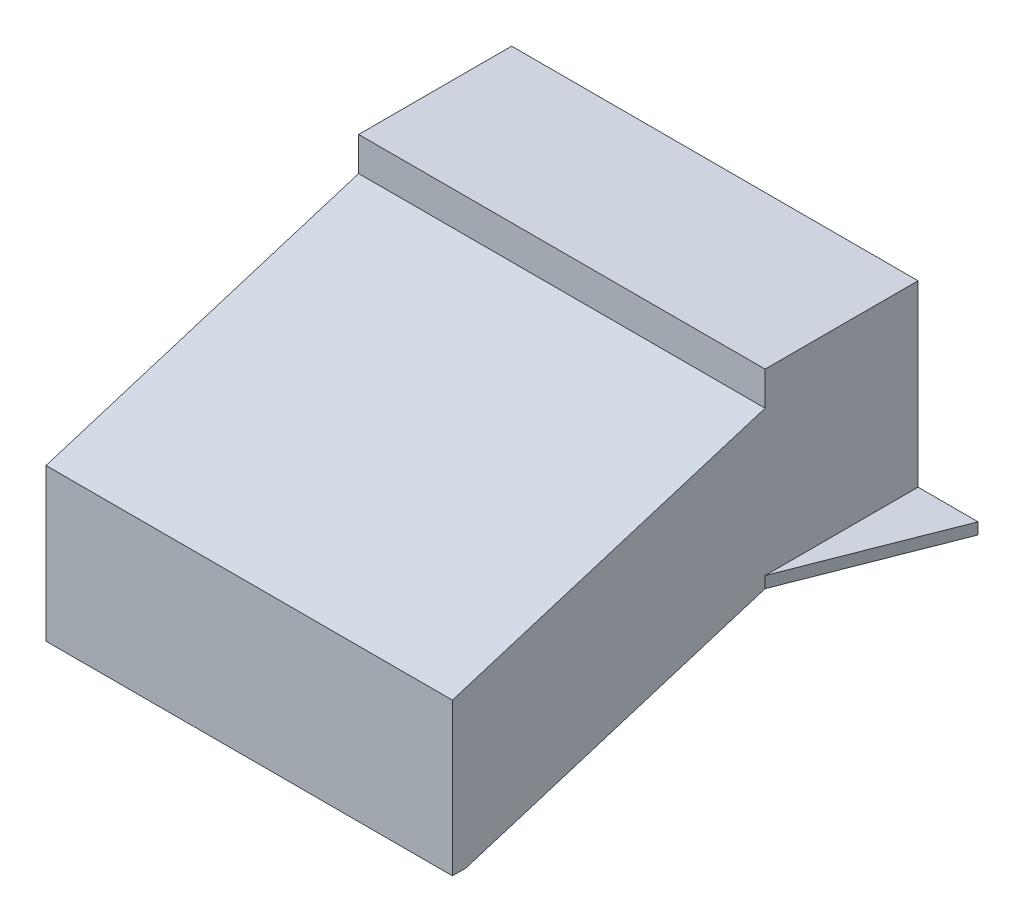
ISO-10303-21;
HEADER;
FILE_DESCRIPTION(('STEP AP214'),'2;1');
FILE_NAME('part.step','',(''),(''),'','','');
FILE_SCHEMA(('AUTOMOTIVE_DESIGN { 1 0 10303 214 1 1 1 1 }'));
ENDSEC;
DATA;
#1=APPLICATION_CONTEXT('core data for automotive mechanical design processes');
#2=APPLICATION_PROTOCOL_DEFINITION('international standard','automotive_design',2000,#1);
#3=PRODUCT_CONTEXT('',#1,'mechanical');
#4=PRODUCT('Part','Part','',(#3));
#5=PRODUCT_RELATED_PRODUCT_CATEGORY('part','',(#4));
#6=PRODUCT_DEFINITION_FORMATION('','',#4);
#7=PRODUCT_DEFINITION_CONTEXT('part definition',#1,'design');
#8=PRODUCT_DEFINITION('design','',#6,#7);
#9=PRODUCT_DEFINITION_SHAPE('','',#8);
#10=(LENGTH_UNIT() NAMED_UNIT(*) SI_UNIT(.MILLI.,.METRE.));
#11=(NAMED_UNIT(*) PLANE_ANGLE_UNIT() SI_UNIT($,.RADIAN.));
#12=(NAMED_UNIT(*) SI_UNIT($,.STERADIAN.) SOLID_ANGLE_UNIT());
#13=UNCERTAINTY_MEASURE_WITH_UNIT(LENGTH_MEASURE(1.E-05),#10,'distance_accuracy_value','');
#14=(GEOMETRIC_REPRESENTATION_CONTEXT(3) GLOBAL_UNCERTAINTY_ASSIGNED_CONTEXT((#13)) GLOBAL_UNIT_ASSIGNED_CONTEXT((#10,
#11,#12)) REPRESENTATION_CONTEXT('',''));
#15=CARTESIAN_POINT('',(0.,0.,0.));
#16=DIRECTION('',(0.,0.,1.));
#17=DIRECTION('',(1.,0.,0.));
#18=AXIS2_PLACEMENT_3D('',#15,#16,#17);
#19=CARTESIAN_POINT('',(91.,55.68,0.));
#20=DIRECTION('',(-1.,0.,0.));
#21=DIRECTION('',(0.,0.,1.));
#22=AXIS2_PLACEMENT_3D('',#19,#20,#21);
#23=PLANE('',#22);
#24=DIRECTION('',(0.,-0.294927547939755,0.955519618566905));
#25=VECTOR('',#24,1.);
#26=CARTESIAN_POINT('',(91.,36.7987931064781,-5.82781132176169));
#27=LINE('',#26,#25);
#28=CARTESIAN_POINT('',(91.,55.68,-67.));
#29=VERTEX_POINT('',#28);
#30=CARTESIAN_POINT('',(91.,34.0740298507613,2.99999999997874));
#31=VERTEX_POINT('',#30);
#32=EDGE_CURVE('E310',#29,#31,#27,.T.);
#33=ORIENTED_EDGE('',*,*,#32,.T.);
#34=DIRECTION('',(0.,1.,0.));
#35=VECTOR('',#34,1.);
#36=CARTESIAN_POINT('',(91.,35.,3.));
#37=LINE('',#36,#35);
#38=CARTESIAN_POINT('',(91.,0.,3.));
#39=VERTEX_POINT('',#38);
#40=EDGE_CURVE('E220',#39,#31,#37,.T.);
#41=ORIENTED_EDGE('',*,*,#40,.F.);
#42=DIRECTION('',(0.,0.,-1.));
#43=VECTOR('',#42,1.);
#44=CARTESIAN_POINT('',(91.,0.,3.));
#45=LINE('',#44,#43);
#46=CARTESIAN_POINT('',(91.,0.,0.));
#47=VERTEX_POINT('',#46);
#48=EDGE_CURVE('E223',#39,#47,#45,.T.);
#49=ORIENTED_EDGE('',*,*,#48,.T.);
#50=DIRECTION('',(0.,0.294927547939755,-0.955519618566905));
#51=VECTOR('',#50,1.);
#52=CARTESIAN_POINT('',(91.,4.84317215515956,-15.691128355691));
#53=LINE('',#52,#51);
#54=CARTESIAN_POINT('',(91.,20.68,-67.));
#55=VERTEX_POINT('',#54);
#56=EDGE_CURVE('E319',#47,#55,#53,.T.);
#57=ORIENTED_EDGE('',*,*,#56,.T.);
#58=DIRECTION('',(0.,-1.,0.));
#59=VECTOR('',#58,1.);
#60=CARTESIAN_POINT('',(91.,20.68,-67.));
#61=LINE('',#60,#59);
#62=CARTESIAN_POINT('',(91.,23.2389421098418,-67.));
#63=VERTEX_POINT('',#62);
#64=EDGE_CURVE('E241',#63,#55,#61,.T.);
#65=ORIENTED_EDGE('',*,*,#64,.F.);
#66=DIRECTION('',(0.,0.,1.));
#67=VECTOR('',#66,1.);
#68=CARTESIAN_POINT('',(91.,23.2389421098418,-67.));
#69=LINE('',#68,#67);
#70=CARTESIAN_POINT('',(91.,23.2389421098418,-101.25));
#71=VERTEX_POINT('',#70);
#72=EDGE_CURVE('E245',#71,#63,#69,.T.);
#73=ORIENTED_EDGE('',*,*,#72,.F.);
#74=DIRECTION('',(0.,-1.,0.));
#75=VECTOR('',#74,1.);
#76=CARTESIAN_POINT('',(91.,55.68,-101.25));
#77=LINE('',#76,#75);
#78=CARTESIAN_POINT('',(91.,63.26,-101.25));
#79=VERTEX_POINT('',#78);
#80=EDGE_CURVE('E275',#79,#71,#77,.T.);
#81=ORIENTED_EDGE('',*,*,#80,.F.);
#82=DIRECTION('',(0.,0.,-1.));
#83=VECTOR('',#82,1.);
#84=CARTESIAN_POINT('',(91.,63.26,-101.25));
#85=LINE('',#84,#83);
#86=CARTESIAN_POINT('',(91.,63.26,-67.));
#87=VERTEX_POINT('',#86);
#88=EDGE_CURVE('E198',#87,#79,#85,.T.);
#89=ORIENTED_EDGE('',*,*,#88,.F.);
#90=DIRECTION('',(0.,-1.,0.));
#91=VECTOR('',#90,1.);
#92=CARTESIAN_POINT('',(91.,63.26,-67.));
#93=LINE('',#92,#91);
#94=EDGE_CURVE('E209',#87,#29,#93,.T.);
#95=ORIENTED_EDGE('',*,*,#94,.T.);
#96=EDGE_LOOP('',(#33,#41,#49,#57,#65,#73,#81,#89,#95));
#97=FACE_BOUND('',#96,.T.);
#98=ADVANCED_FACE('F34',(#97),#23,.F.);
#99=CARTESIAN_POINT('',(0.,55.68,0.));
#100=DIRECTION('',(1.,0.,0.));
#101=DIRECTION('',(0.,0.,-1.));
#102=AXIS2_PLACEMENT_3D('',#99,#100,#101);
#103=PLANE('',#102);
#104=DIRECTION('',(0.,-1.,0.));
#105=VECTOR('',#104,1.);
#106=CARTESIAN_POINT('',(0.,35.,3.));
#107=LINE('',#106,#105);
#108=CARTESIAN_POINT('',(0.,34.0740298507613,3.));
#109=VERTEX_POINT('',#108);
#110=CARTESIAN_POINT('',(0.,0.,3.));
#111=VERTEX_POINT('',#110);
#112=EDGE_CURVE('E216',#109,#111,#107,.T.);
#113=ORIENTED_EDGE('',*,*,#112,.F.);
#114=DIRECTION('',(0.,-0.294927547939755,0.955519618566905));
#115=VECTOR('',#114,1.);
#116=CARTESIAN_POINT('',(0.,35.,0.));
#117=LINE('',#116,#115);
#118=CARTESIAN_POINT('',(0.,55.68,-67.));
#119=VERTEX_POINT('',#118);
#120=EDGE_CURVE('E56',#119,#109,#117,.T.);
#121=ORIENTED_EDGE('',*,*,#120,.F.);
#122=DIRECTION('',(0.,-1.,0.));
#123=VECTOR('',#122,1.);
#124=CARTESIAN_POINT('',(0.,63.26,-67.));
#125=LINE('',#124,#123);
#126=CARTESIAN_POINT('',(0.,63.26,-67.));
#127=VERTEX_POINT('',#126);
#128=EDGE_CURVE('E212',#127,#119,#125,.T.);
#129=ORIENTED_EDGE('',*,*,#128,.F.);
#130=DIRECTION('',(0.,0.,1.));
#131=VECTOR('',#130,1.);
#132=CARTESIAN_POINT('',(0.,63.26,-101.25));
#133=LINE('',#132,#131);
#134=CARTESIAN_POINT('',(0.,63.26,-101.25));
#135=VERTEX_POINT('',#134);
#136=EDGE_CURVE('E205',#135,#127,#133,.T.);
#137=ORIENTED_EDGE('',*,*,#136,.F.);
#138=DIRECTION('',(0.,1.,0.));
#139=VECTOR('',#138,1.);
#140=CARTESIAN_POINT('',(0.,55.68,-101.25));
#141=LINE('',#140,#139);
#142=CARTESIAN_POINT('',(0.,23.2300552231024,-101.25));
#143=VERTEX_POINT('',#142);
#144=EDGE_CURVE('E284',#143,#135,#141,.T.);
#145=ORIENTED_EDGE('',*,*,#144,.F.);
#146=DIRECTION('',(0.,0.,-1.));
#147=VECTOR('',#146,1.);
#148=CARTESIAN_POINT('',(0.,23.2300552231024,-67.));
#149=LINE('',#148,#147);
#150=CARTESIAN_POINT('',(0.,23.2300552231024,-67.));
#151=VERTEX_POINT('',#150);
#152=EDGE_CURVE('E255',#151,#143,#149,.T.);
#153=ORIENTED_EDGE('',*,*,#152,.F.);
#154=DIRECTION('',(0.,1.,0.));
#155=VECTOR('',#154,1.);
#156=CARTESIAN_POINT('',(0.,20.68,-67.));
#157=LINE('',#156,#155);
#158=CARTESIAN_POINT('',(0.,20.68,-67.));
#159=VERTEX_POINT('',#158);
#160=EDGE_CURVE('E251',#159,#151,#157,.T.);
#161=ORIENTED_EDGE('',*,*,#160,.F.);
#162=DIRECTION('',(0.,0.294927547939755,-0.955519618566905));
#163=VECTOR('',#162,1.);
#164=CARTESIAN_POINT('',(0.,20.68,-67.));
#165=LINE('',#164,#163);
#166=CARTESIAN_POINT('',(0.,0.,0.));
#167=VERTEX_POINT('',#166);
#168=EDGE_CURVE('E312',#167,#159,#165,.T.);
#169=ORIENTED_EDGE('',*,*,#168,.F.);
#170=DIRECTION('',(0.,0.,-1.));
#171=VECTOR('',#170,1.);
#172=CARTESIAN_POINT('',(0.,0.,3.));
#173=LINE('',#172,#171);
#174=EDGE_CURVE('E228',#111,#167,#173,.T.);
#175=ORIENTED_EDGE('',*,*,#174,.F.);
#176=EDGE_LOOP('',(#113,#121,#129,#137,#145,#153,#161,#169,#175));
#177=FACE_BOUND('',#176,.T.);
#178=ADVANCED_FACE('F36',(#177),#103,.F.);
#179=CARTESIAN_POINT('',(91.,20.68,-101.25));
#180=DIRECTION('',(0.,1.,0.));
#181=DIRECTION('',(0.,0.,1.));
#182=AXIS2_PLACEMENT_3D('',#179,#180,#181);
#183=PLANE('',#182);
#184=DIRECTION('',(-1.,0.,0.));
#185=VECTOR('',#184,1.);
#186=CARTESIAN_POINT('',(91.,20.68,-101.25));
#187=LINE('',#186,#185);
#188=CARTESIAN_POINT('',(104.42,20.68,-101.25));
#189=VERTEX_POINT('',#188);
#190=CARTESIAN_POINT('',(89.,20.68,-101.25));
#191=VERTEX_POINT('',#190);
#192=EDGE_CURVE('E281',#189,#191,#187,.T.);
#193=ORIENTED_EDGE('',*,*,#192,.F.);
#194=DIRECTION('',(-0.364819561220122,0.,0.931078239328553));
#195=VECTOR('',#194,1.);
#196=CARTESIAN_POINT('',(102.633887749621,20.68,-96.6915540554772));
#197=LINE('',#196,#195);
#198=EDGE_CURVE('E233',#189,#55,#197,.T.);
#199=ORIENTED_EDGE('',*,*,#198,.T.);
#200=DIRECTION('',(-1.,0.,0.));
#201=VECTOR('',#200,1.);
#202=CARTESIAN_POINT('',(99.,20.68,-67.));
#203=LINE('',#202,#201);
#204=CARTESIAN_POINT('',(89.,20.68,-67.));
#205=VERTEX_POINT('',#204);
#206=EDGE_CURVE('E316',#55,#205,#203,.T.);
#207=ORIENTED_EDGE('',*,*,#206,.T.);
#208=DIRECTION('',(0.,0.,1.));
#209=VECTOR('',#208,1.);
#210=CARTESIAN_POINT('',(89.,20.68,-67.));
#211=LINE('',#210,#209);
#212=EDGE_CURVE('E261',#191,#205,#211,.T.);
#213=ORIENTED_EDGE('',*,*,#212,.F.);
#214=EDGE_LOOP('',(#193,#199,#207,#213));
#215=FACE_BOUND('',#214,.T.);
#216=ADVANCED_FACE('F376',(#215),#183,.F.);
#217=CARTESIAN_POINT('',(99.,20.68,-67.));
#218=DIRECTION('',(0.,0.955519618566905,0.294927547939755));
#219=DIRECTION('',(0.,-0.294927547939755,0.955519618566905));
#220=AXIS2_PLACEMENT_3D('',#217,#218,#219);
#221=PLANE('',#220);
#222=CARTESIAN_POINT('',(2.,20.68,-67.));
#223=VERTEX_POINT('',#222);
#224=EDGE_CURVE('E315',#223,#159,#203,.T.);
#225=ORIENTED_EDGE('',*,*,#224,.F.);
#226=DIRECTION('',(0.,0.294927547939755,-0.955519618566905));
#227=VECTOR('',#226,1.);
#228=CARTESIAN_POINT('',(2.,0.,0.));
#229=LINE('',#228,#227);
#230=CARTESIAN_POINT('',(2.,0.,0.));
#231=VERTEX_POINT('',#230);
#232=EDGE_CURVE('E286',#231,#223,#229,.T.);
#233=ORIENTED_EDGE('',*,*,#232,.F.);
#234=DIRECTION('',(1.,0.,0.));
#235=VECTOR('',#234,1.);
#236=CARTESIAN_POINT('',(0.,0.,0.));
#237=LINE('',#236,#235);
#238=EDGE_CURVE('E326',#167,#231,#237,.T.);
#239=ORIENTED_EDGE('',*,*,#238,.F.);
#240=ORIENTED_EDGE('',*,*,#168,.T.);
#241=EDGE_LOOP('',(#225,#233,#239,#240));
#242=FACE_BOUND('',#241,.T.);
#243=ADVANCED_FACE('F352',(#242),#221,.F.);
#244=CARTESIAN_POINT('',(89.,0.,0.));
#245=VERTEX_POINT('',#244);
#246=EDGE_CURVE('E322',#245,#47,#237,.T.);
#247=ORIENTED_EDGE('',*,*,#246,.F.);
#248=DIRECTION('',(0.,0.294927547939755,-0.955519618566905));
#249=VECTOR('',#248,1.);
#250=CARTESIAN_POINT('',(89.,20.68,-67.));
#251=LINE('',#250,#249);
#252=EDGE_CURVE('E325',#245,#205,#251,.T.);
#253=ORIENTED_EDGE('',*,*,#252,.T.);
#254=ORIENTED_EDGE('',*,*,#206,.F.);
#255=ORIENTED_EDGE('',*,*,#56,.F.);
#256=EDGE_LOOP('',(#247,#253,#254,#255));
#257=FACE_BOUND('',#256,.T.);
#258=ADVANCED_FACE('F379',(#257),#221,.F.);
#259=CARTESIAN_POINT('',(99.,35.,0.));
#260=DIRECTION('',(0.,-0.955519618566905,-0.294927547939755));
#261=DIRECTION('',(0.,0.294927547939755,-0.955519618566905));
#262=AXIS2_PLACEMENT_3D('',#259,#260,#261);
#263=PLANE('',#262);
#264=DIRECTION('',(-1.,0.,0.));
#265=VECTOR('',#264,1.);
#266=CARTESIAN_POINT('',(0.,55.68,-67.));
#267=LINE('',#266,#265);
#268=EDGE_CURVE('E323',#29,#119,#267,.T.);
#269=ORIENTED_EDGE('',*,*,#268,.T.);
#270=ORIENTED_EDGE('',*,*,#120,.T.);
#271=DIRECTION('',(1.,0.,0.));
#272=VECTOR('',#271,1.);
#273=CARTESIAN_POINT('',(0.,34.0740298507548,3.));
#274=LINE('',#273,#272);
#275=EDGE_CURVE('E11',#109,#31,#274,.T.);
#276=ORIENTED_EDGE('',*,*,#275,.T.);
#277=ORIENTED_EDGE('',*,*,#32,.F.);
#278=EDGE_LOOP('',(#269,#270,#276,#277));
#279=FACE_BOUND('',#278,.T.);
#280=ADVANCED_FACE('F390',(#279),#263,.F.);
#281=CARTESIAN_POINT('',(0.,29.6211081755741,9.14275398613241));
#282=DIRECTION('',(0.,0.955519618566905,0.294927547939755));
#283=DIRECTION('',(0.,-0.294927547939755,0.955519618566905));
#284=AXIS2_PLACEMENT_3D('',#281,#282,#283);
#285=PLANE('',#284);
#286=DIRECTION('',(0.,0.294927547939755,-0.955519618566905));
#287=VECTOR('',#286,1.);
#288=CARTESIAN_POINT('',(2.,29.6211081755741,9.14275398613241));
#289=LINE('',#288,#287);
#290=CARTESIAN_POINT('',(2.,32.4430805999504,0.));
#291=VERTEX_POINT('',#290);
#292=CARTESIAN_POINT('',(2.,53.1230805999504,-67.));
#293=VERTEX_POINT('',#292);
#294=EDGE_CURVE('E287',#291,#293,#289,.T.);
#295=ORIENTED_EDGE('',*,*,#294,.T.);
#296=DIRECTION('',(-1.,0.,0.));
#297=VECTOR('',#296,1.);
#298=CARTESIAN_POINT('',(0.,53.1230805999504,-67.));
#299=LINE('',#298,#297);
#300=CARTESIAN_POINT('',(89.,53.1230805999504,-67.));
#301=VERTEX_POINT('',#300);
#302=EDGE_CURVE('E42',#301,#293,#299,.T.);
#303=ORIENTED_EDGE('',*,*,#302,.F.);
#304=DIRECTION('',(0.,-0.294927547939755,0.955519618566905));
#305=VECTOR('',#304,1.);
#306=CARTESIAN_POINT('',(89.,29.6211081755741,9.14275398613241));
#307=LINE('',#306,#305);
#308=CARTESIAN_POINT('',(89.,32.4430805999504,0.));
#309=VERTEX_POINT('',#308);
#310=EDGE_CURVE('E290',#301,#309,#307,.T.);
#311=ORIENTED_EDGE('',*,*,#310,.T.);
#312=DIRECTION('',(1.,0.,0.));
#313=VECTOR('',#312,1.);
#314=CARTESIAN_POINT('',(0.,32.4430805999504,0.));
#315=LINE('',#314,#313);
#316=EDGE_CURVE('E306',#291,#309,#315,.T.);
#317=ORIENTED_EDGE('',*,*,#316,.F.);
#318=EDGE_LOOP('',(#295,#303,#311,#317));
#319=FACE_BOUND('',#318,.T.);
#320=ADVANCED_FACE('F336',(#319),#285,.F.);
#321=CARTESIAN_POINT('',(2.,29.6211081755741,9.14275398613241));
#322=DIRECTION('',(-1.,0.,0.));
#323=DIRECTION('',(0.,0.,1.));
#324=AXIS2_PLACEMENT_3D('',#321,#322,#323);
#325=PLANE('',#324);
#326=ORIENTED_EDGE('',*,*,#232,.T.);
#327=DIRECTION('',(0.,0.,-1.));
#328=VECTOR('',#327,1.);
#329=CARTESIAN_POINT('',(2.,20.68,-67.));
#330=LINE('',#329,#328);
#331=CARTESIAN_POINT('',(2.,20.68,-101.25));
#332=VERTEX_POINT('',#331);
#333=EDGE_CURVE('E264',#223,#332,#330,.T.);
#334=ORIENTED_EDGE('',*,*,#333,.T.);
#335=DIRECTION('',(0.,-1.,0.));
#336=VECTOR('',#335,1.);
#337=CARTESIAN_POINT('',(2.,53.12,-101.25));
#338=LINE('',#337,#336);
#339=CARTESIAN_POINT('',(2.,60.25,-101.25));
#340=VERTEX_POINT('',#339);
#341=EDGE_CURVE('E270',#340,#332,#338,.T.);
#342=ORIENTED_EDGE('',*,*,#341,.F.);
#343=DIRECTION('',(0.,0.,-1.));
#344=VECTOR('',#343,1.);
#345=CARTESIAN_POINT('',(2.,60.25,-101.25));
#346=LINE('',#345,#344);
#347=CARTESIAN_POINT('',(2.,60.25,-69.3196896173482));
#348=VERTEX_POINT('',#347);
#349=EDGE_CURVE('E188',#348,#340,#346,.T.);
#350=ORIENTED_EDGE('',*,*,#349,.F.);
#351=DIRECTION('',(0.,-1.,0.));
#352=VECTOR('',#351,1.);
#353=CARTESIAN_POINT('',(2.,60.25,-69.3196896173482));
#354=LINE('',#353,#352);
#355=CARTESIAN_POINT('',(2.,53.12,-69.3196896173482));
#356=VERTEX_POINT('',#355);
#357=EDGE_CURVE('E179',#348,#356,#354,.T.);
#358=ORIENTED_EDGE('',*,*,#357,.T.);
#359=DIRECTION('',(0.,0.,-1.));
#360=VECTOR('',#359,1.);
#361=CARTESIAN_POINT('',(2.,53.12,-67.));
#362=LINE('',#361,#360);
#363=CARTESIAN_POINT('',(2.,53.12,-67.));
#364=VERTEX_POINT('',#363);
#365=EDGE_CURVE('E267',#364,#356,#362,.T.);
#366=ORIENTED_EDGE('',*,*,#365,.F.);
#367=DIRECTION('',(0.,-1.,0.));
#368=VECTOR('',#367,1.);
#369=CARTESIAN_POINT('',(2.,55.68,-67.));
#370=LINE('',#369,#368);
#371=EDGE_CURVE('E300',#293,#364,#370,.T.);
#372=ORIENTED_EDGE('',*,*,#371,.F.);
#373=ORIENTED_EDGE('',*,*,#294,.F.);
#374=DIRECTION('',(0.,1.,0.));
#375=VECTOR('',#374,1.);
#376=CARTESIAN_POINT('',(2.,55.68,0.));
#377=LINE('',#376,#375);
#378=EDGE_CURVE('E303',#231,#291,#377,.T.);
#379=ORIENTED_EDGE('',*,*,#378,.F.);
#380=EDGE_LOOP('',(#326,#334,#342,#350,#358,#366,#372,#373,#379));
#381=FACE_BOUND('',#380,.T.);
#382=ADVANCED_FACE('F339',(#381),#325,.F.);
#383=CARTESIAN_POINT('',(89.,29.6211081755741,9.14275398613241));
#384=DIRECTION('',(1.,0.,0.));
#385=DIRECTION('',(0.,0.,-1.));
#386=AXIS2_PLACEMENT_3D('',#383,#384,#385);
#387=PLANE('',#386);
#388=ORIENTED_EDGE('',*,*,#310,.F.);
#389=DIRECTION('',(0.,1.,0.));
#390=VECTOR('',#389,1.);
#391=CARTESIAN_POINT('',(89.,55.68,-67.));
#392=LINE('',#391,#390);
#393=CARTESIAN_POINT('',(89.,53.12,-67.));
#394=VERTEX_POINT('',#393);
#395=EDGE_CURVE('E293',#394,#301,#392,.T.);
#396=ORIENTED_EDGE('',*,*,#395,.F.);
#397=DIRECTION('',(0.,0.,1.));
#398=VECTOR('',#397,1.);
#399=CARTESIAN_POINT('',(89.,53.12,-67.));
#400=LINE('',#399,#398);
#401=CARTESIAN_POINT('',(89.,53.12,-69.3196896173482));
#402=VERTEX_POINT('',#401);
#403=EDGE_CURVE('E178',#402,#394,#400,.T.);
#404=ORIENTED_EDGE('',*,*,#403,.F.);
#405=DIRECTION('',(0.,-1.,0.));
#406=VECTOR('',#405,1.);
#407=CARTESIAN_POINT('',(89.,60.25,-69.3196896173482));
#408=LINE('',#407,#406);
#409=CARTESIAN_POINT('',(89.,60.25,-69.3196896173482));
#410=VERTEX_POINT('',#409);
#411=EDGE_CURVE('E49',#410,#402,#408,.T.);
#412=ORIENTED_EDGE('',*,*,#411,.F.);
#413=DIRECTION('',(0.,0.,1.));
#414=VECTOR('',#413,1.);
#415=CARTESIAN_POINT('',(89.,60.25,-101.25));
#416=LINE('',#415,#414);
#417=CARTESIAN_POINT('',(89.,60.25,-101.25));
#418=VERTEX_POINT('',#417);
#419=EDGE_CURVE('E175',#418,#410,#416,.T.);
#420=ORIENTED_EDGE('',*,*,#419,.F.);
#421=DIRECTION('',(0.,-1.,0.));
#422=VECTOR('',#421,1.);
#423=CARTESIAN_POINT('',(89.,53.12,-101.25));
#424=LINE('',#423,#422);
#425=EDGE_CURVE('E273',#418,#191,#424,.T.);
#426=ORIENTED_EDGE('',*,*,#425,.T.);
#427=ORIENTED_EDGE('',*,*,#212,.T.);
#428=ORIENTED_EDGE('',*,*,#252,.F.);
#429=DIRECTION('',(0.,-1.,0.));
#430=VECTOR('',#429,1.);
#431=CARTESIAN_POINT('',(89.,55.68,0.));
#432=LINE('',#431,#430);
#433=EDGE_CURVE('E297',#309,#245,#432,.T.);
#434=ORIENTED_EDGE('',*,*,#433,.F.);
#435=EDGE_LOOP('',(#388,#396,#404,#412,#420,#426,#427,#428,#434));
#436=FACE_BOUND('',#435,.T.);
#437=ADVANCED_FACE('F173',(#436),#387,.F.);
#438=CARTESIAN_POINT('',(0.,0.,-67.));
#439=DIRECTION('',(0.,0.,-1.));
#440=DIRECTION('',(-1.,0.,0.));
#441=AXIS2_PLACEMENT_3D('',#438,#439,#440);
#442=PLANE('',#441);
#443=ORIENTED_EDGE('',*,*,#371,.T.);
#444=DIRECTION('',(-1.,0.,0.));
#445=VECTOR('',#444,1.);
#446=CARTESIAN_POINT('',(89.,53.12,-67.));
#447=LINE('',#446,#445);
#448=EDGE_CURVE('E263',#394,#364,#447,.T.);
#449=ORIENTED_EDGE('',*,*,#448,.F.);
#450=ORIENTED_EDGE('',*,*,#395,.T.);
#451=ORIENTED_EDGE('',*,*,#302,.T.);
#452=EDGE_LOOP('',(#443,#449,#450,#451));
#453=FACE_BOUND('',#452,.T.);
#454=ADVANCED_FACE('F333',(#453),#442,.F.);
#455=ORIENTED_EDGE('',*,*,#224,.T.);
#456=DIRECTION('',(-0.364819561220122,0.,-0.931078239328553));
#457=VECTOR('',#456,1.);
#458=CARTESIAN_POINT('',(0.477603665024112,20.68,-65.7810785747336));
#459=LINE('',#458,#457);
#460=CARTESIAN_POINT('',(-13.42,20.68,-101.25));
#461=VERTEX_POINT('',#460);
#462=EDGE_CURVE('E238',#159,#461,#459,.T.);
#463=ORIENTED_EDGE('',*,*,#462,.T.);
#464=EDGE_CURVE('E280',#332,#461,#187,.T.);
#465=ORIENTED_EDGE('',*,*,#464,.F.);
#466=ORIENTED_EDGE('',*,*,#333,.F.);
#467=EDGE_LOOP('',(#455,#463,#465,#466));
#468=FACE_BOUND('',#467,.T.);
#469=ADVANCED_FACE('F370',(#468),#183,.F.);
#470=CARTESIAN_POINT('',(0.,0.,-101.25));
#471=DIRECTION('',(0.,0.,-1.));
#472=DIRECTION('',(-1.,0.,0.));
#473=AXIS2_PLACEMENT_3D('',#470,#471,#472);
#474=PLANE('',#473);
#475=ORIENTED_EDGE('',*,*,#425,.F.);
#476=DIRECTION('',(1.,0.,0.));
#477=VECTOR('',#476,1.);
#478=CARTESIAN_POINT('',(89.,60.25,-101.25));
#479=LINE('',#478,#477);
#480=EDGE_CURVE('E180',#340,#418,#479,.T.);
#481=ORIENTED_EDGE('',*,*,#480,.F.);
#482=ORIENTED_EDGE('',*,*,#341,.T.);
#483=ORIENTED_EDGE('',*,*,#464,.T.);
#484=DIRECTION('',(0.,-1.,0.));
#485=VECTOR('',#484,1.);
#486=CARTESIAN_POINT('',(-13.42,20.68,-101.25));
#487=LINE('',#486,#485);
#488=CARTESIAN_POINT('',(-13.42,23.2300552231024,-101.25));
#489=VERTEX_POINT('',#488);
#490=EDGE_CURVE('E252',#489,#461,#487,.T.);
#491=ORIENTED_EDGE('',*,*,#490,.F.);
#492=DIRECTION('',(1.,0.,0.));
#493=VECTOR('',#492,1.);
#494=CARTESIAN_POINT('',(-13.42,23.2300552231024,-101.25));
#495=LINE('',#494,#493);
#496=EDGE_CURVE('E254',#489,#143,#495,.T.);
#497=ORIENTED_EDGE('',*,*,#496,.T.);
#498=ORIENTED_EDGE('',*,*,#144,.T.);
#499=DIRECTION('',(-1.,0.,0.));
#500=VECTOR('',#499,1.);
#501=CARTESIAN_POINT('',(91.,63.26,-101.25));
#502=LINE('',#501,#500);
#503=EDGE_CURVE('E202',#79,#135,#502,.T.);
#504=ORIENTED_EDGE('',*,*,#503,.F.);
#505=ORIENTED_EDGE('',*,*,#80,.T.);
#506=DIRECTION('',(-1.,0.,0.));
#507=VECTOR('',#506,1.);
#508=CARTESIAN_POINT('',(104.42,23.2389421098418,-101.25));
#509=LINE('',#508,#507);
#510=CARTESIAN_POINT('',(104.42,23.2389421098418,-101.25));
#511=VERTEX_POINT('',#510);
#512=EDGE_CURVE('E244',#511,#71,#509,.T.);
#513=ORIENTED_EDGE('',*,*,#512,.F.);
#514=DIRECTION('',(0.,1.,0.));
#515=VECTOR('',#514,1.);
#516=CARTESIAN_POINT('',(104.42,20.68,-101.25));
#517=LINE('',#516,#515);
#518=EDGE_CURVE('E242',#189,#511,#517,.T.);
#519=ORIENTED_EDGE('',*,*,#518,.F.);
#520=ORIENTED_EDGE('',*,*,#192,.T.);
#521=EDGE_LOOP('',(#475,#481,#482,#483,#491,#497,#498,#504,#505,#513,#519,#520));
#522=FACE_BOUND('',#521,.T.);
#523=ADVANCED_FACE('F367',(#522),#474,.T.);
#524=CARTESIAN_POINT('',(0.,53.12,0.));
#525=DIRECTION('',(0.,1.,0.));
#526=DIRECTION('',(0.,0.,1.));
#527=AXIS2_PLACEMENT_3D('',#524,#525,#526);
#528=PLANE('',#527);
#529=ORIENTED_EDGE('',*,*,#365,.T.);
#530=DIRECTION('',(-1.,0.,0.));
#531=VECTOR('',#530,1.);
#532=CARTESIAN_POINT('',(89.,53.12,-69.3196896173482));
#533=LINE('',#532,#531);
#534=EDGE_CURVE('E192',#402,#356,#533,.T.);
#535=ORIENTED_EDGE('',*,*,#534,.F.);
#536=ORIENTED_EDGE('',*,*,#403,.T.);
#537=ORIENTED_EDGE('',*,*,#448,.T.);
#538=EDGE_LOOP('',(#529,#535,#536,#537));
#539=FACE_BOUND('',#538,.T.);
#540=ADVANCED_FACE('F434',(#539),#528,.F.);
#541=CARTESIAN_POINT('',(-13.42,23.2300552231024,-67.));
#542=DIRECTION('',(0.,-1.,0.));
#543=DIRECTION('',(0.,0.,-1.));
#544=AXIS2_PLACEMENT_3D('',#541,#542,#543);
#545=PLANE('',#544);
#546=ORIENTED_EDGE('',*,*,#496,.F.);
#547=DIRECTION('',(-0.364819561220122,0.,-0.931078239328553));
#548=VECTOR('',#547,1.);
#549=CARTESIAN_POINT('',(-13.42,23.2300552231024,-101.25));
#550=LINE('',#549,#548);
#551=EDGE_CURVE('E236',#151,#489,#550,.T.);
#552=ORIENTED_EDGE('',*,*,#551,.F.);
#553=ORIENTED_EDGE('',*,*,#152,.T.);
#554=EDGE_LOOP('',(#546,#552,#553));
#555=FACE_BOUND('',#554,.T.);
#556=ADVANCED_FACE('F363',(#555),#545,.F.);
#557=CARTESIAN_POINT('',(104.42,23.2389421098418,-67.));
#558=DIRECTION('',(0.,-1.,0.));
#559=DIRECTION('',(0.,0.,-1.));
#560=AXIS2_PLACEMENT_3D('',#557,#558,#559);
#561=PLANE('',#560);
#562=ORIENTED_EDGE('',*,*,#72,.T.);
#563=DIRECTION('',(-0.364819561220122,0.,0.931078239328553));
#564=VECTOR('',#563,1.);
#565=CARTESIAN_POINT('',(91.,23.2389421098418,-67.));
#566=LINE('',#565,#564);
#567=EDGE_CURVE('E231',#511,#63,#566,.T.);
#568=ORIENTED_EDGE('',*,*,#567,.F.);
#569=ORIENTED_EDGE('',*,*,#512,.T.);
#570=EDGE_LOOP('',(#562,#568,#569));
#571=FACE_BOUND('',#570,.T.);
#572=ADVANCED_FACE('F401',(#571),#561,.F.);
#573=CARTESIAN_POINT('',(-13.42,9.8100552231024,-101.25));
#574=DIRECTION('',(0.931078239328553,0.,-0.364819561220122));
#575=DIRECTION('',(-0.364819561220122,0.,-0.931078239328553));
#576=AXIS2_PLACEMENT_3D('',#573,#574,#575);
#577=PLANE('',#576);
#578=ORIENTED_EDGE('',*,*,#160,.T.);
#579=ORIENTED_EDGE('',*,*,#551,.T.);
#580=ORIENTED_EDGE('',*,*,#490,.T.);
#581=ORIENTED_EDGE('',*,*,#462,.F.);
#582=EDGE_LOOP('',(#578,#579,#580,#581));
#583=FACE_BOUND('',#582,.T.);
#584=ADVANCED_FACE('F360',(#583),#577,.F.);
#585=CARTESIAN_POINT('',(91.,9.81894210984179,-67.));
#586=DIRECTION('',(-0.931078239328553,0.,-0.364819561220122));
#587=DIRECTION('',(-0.364819561220122,0.,0.931078239328553));
#588=AXIS2_PLACEMENT_3D('',#585,#586,#587);
#589=PLANE('',#588);
#590=ORIENTED_EDGE('',*,*,#518,.T.);
#591=ORIENTED_EDGE('',*,*,#567,.T.);
#592=ORIENTED_EDGE('',*,*,#64,.T.);
#593=ORIENTED_EDGE('',*,*,#198,.F.);
#594=EDGE_LOOP('',(#590,#591,#592,#593));
#595=FACE_BOUND('',#594,.T.);
#596=ADVANCED_FACE('F403',(#595),#589,.F.);
#597=CARTESIAN_POINT('',(0.,0.,0.));
#598=DIRECTION('',(0.,0.,1.));
#599=DIRECTION('',(1.,0.,0.));
#600=AXIS2_PLACEMENT_3D('',#597,#598,#599);
#601=PLANE('',#600);
#602=DIRECTION('',(1.,0.,0.));
#603=VECTOR('',#602,1.);
#604=CARTESIAN_POINT('',(0.,0.,0.));
#605=LINE('',#604,#603);
#606=EDGE_CURVE('E215',#231,#245,#605,.T.);
#607=ORIENTED_EDGE('',*,*,#606,.F.);
#608=ORIENTED_EDGE('',*,*,#378,.T.);
#609=ORIENTED_EDGE('',*,*,#316,.T.);
#610=ORIENTED_EDGE('',*,*,#433,.T.);
#611=EDGE_LOOP('',(#607,#608,#609,#610));
#612=FACE_BOUND('',#611,.T.);
#613=ADVANCED_FACE('F343',(#612),#601,.F.);
#614=CARTESIAN_POINT('',(0.,0.,3.));
#615=DIRECTION('',(0.,1.,0.));
#616=DIRECTION('',(0.,0.,1.));
#617=AXIS2_PLACEMENT_3D('',#614,#615,#616);
#618=PLANE('',#617);
#619=ORIENTED_EDGE('',*,*,#238,.T.);
#620=ORIENTED_EDGE('',*,*,#606,.T.);
#621=ORIENTED_EDGE('',*,*,#246,.T.);
#622=ORIENTED_EDGE('',*,*,#48,.F.);
#623=DIRECTION('',(1.,0.,0.));
#624=VECTOR('',#623,1.);
#625=CARTESIAN_POINT('',(0.,0.,3.));
#626=LINE('',#625,#624);
#627=EDGE_CURVE('E218',#111,#39,#626,.T.);
#628=ORIENTED_EDGE('',*,*,#627,.F.);
#629=ORIENTED_EDGE('',*,*,#174,.T.);
#630=EDGE_LOOP('',(#619,#620,#621,#622,#628,#629));
#631=FACE_BOUND('',#630,.T.);
#632=ADVANCED_FACE('F346',(#631),#618,.F.);
#633=CARTESIAN_POINT('',(0.,0.,3.));
#634=DIRECTION('',(0.,0.,1.));
#635=DIRECTION('',(1.,0.,0.));
#636=AXIS2_PLACEMENT_3D('',#633,#634,#635);
#637=PLANE('',#636);
#638=ORIENTED_EDGE('',*,*,#275,.F.);
#639=ORIENTED_EDGE('',*,*,#112,.T.);
#640=ORIENTED_EDGE('',*,*,#627,.T.);
#641=ORIENTED_EDGE('',*,*,#40,.T.);
#642=EDGE_LOOP('',(#638,#639,#640,#641));
#643=FACE_BOUND('',#642,.T.);
#644=ADVANCED_FACE('F385',(#643),#637,.T.);
#645=CARTESIAN_POINT('',(91.,63.26,-67.));
#646=DIRECTION('',(0.,0.,-1.));
#647=DIRECTION('',(-1.,0.,0.));
#648=AXIS2_PLACEMENT_3D('',#645,#646,#647);
#649=PLANE('',#648);
#650=ORIENTED_EDGE('',*,*,#268,.F.);
#651=ORIENTED_EDGE('',*,*,#94,.F.);
#652=DIRECTION('',(1.,0.,0.));
#653=VECTOR('',#652,1.);
#654=CARTESIAN_POINT('',(91.,63.26,-67.));
#655=LINE('',#654,#653);
#656=EDGE_CURVE('E207',#127,#87,#655,.T.);
#657=ORIENTED_EDGE('',*,*,#656,.F.);
#658=ORIENTED_EDGE('',*,*,#128,.T.);
#659=EDGE_LOOP('',(#650,#651,#657,#658));
#660=FACE_BOUND('',#659,.T.);
#661=ADVANCED_FACE('F393',(#660),#649,.F.);
#662=CARTESIAN_POINT('',(0.,63.26,0.));
#663=DIRECTION('',(0.,-1.,0.));
#664=DIRECTION('',(0.,0.,-1.));
#665=AXIS2_PLACEMENT_3D('',#662,#663,#664);
#666=PLANE('',#665);
#667=ORIENTED_EDGE('',*,*,#88,.T.);
#668=ORIENTED_EDGE('',*,*,#503,.T.);
#669=ORIENTED_EDGE('',*,*,#136,.T.);
#670=ORIENTED_EDGE('',*,*,#656,.T.);
#671=EDGE_LOOP('',(#667,#668,#669,#670));
#672=FACE_BOUND('',#671,.T.);
#673=ADVANCED_FACE('F396',(#672),#666,.F.);
#674=CARTESIAN_POINT('',(89.,60.25,-69.3196896173482));
#675=DIRECTION('',(0.,0.,1.));
#676=DIRECTION('',(1.,0.,0.));
#677=AXIS2_PLACEMENT_3D('',#674,#675,#676);
#678=PLANE('',#677);
#679=ORIENTED_EDGE('',*,*,#534,.T.);
#680=ORIENTED_EDGE('',*,*,#357,.F.);
#681=DIRECTION('',(-1.,0.,0.));
#682=VECTOR('',#681,1.);
#683=CARTESIAN_POINT('',(89.,60.25,-69.3196896173482));
#684=LINE('',#683,#682);
#685=EDGE_CURVE('E183',#410,#348,#684,.T.);
#686=ORIENTED_EDGE('',*,*,#685,.F.);
#687=ORIENTED_EDGE('',*,*,#411,.T.);
#688=EDGE_LOOP('',(#679,#680,#686,#687));
#689=FACE_BOUND('',#688,.T.);
#690=ADVANCED_FACE('F184',(#689),#678,.F.);
#691=CARTESIAN_POINT('',(0.,60.25,0.));
#692=DIRECTION('',(0.,-1.,0.));
#693=DIRECTION('',(0.,0.,-1.));
#694=AXIS2_PLACEMENT_3D('',#691,#692,#693);
#695=PLANE('',#694);
#696=ORIENTED_EDGE('',*,*,#419,.T.);
#697=ORIENTED_EDGE('',*,*,#685,.T.);
#698=ORIENTED_EDGE('',*,*,#349,.T.);
#699=ORIENTED_EDGE('',*,*,#480,.T.);
#700=EDGE_LOOP('',(#696,#697,#698,#699));
#701=FACE_BOUND('',#700,.T.);
#702=ADVANCED_FACE('F190',(#701),#695,.T.);
#703=CLOSED_SHELL('',(#98,#178,#216,#243,#258,#280,#320,#382,#437,#454,#469,#523,#540,#556,#572,
#584,#596,#613,#632,#644,#661,#673,#690,#702));
#704=MANIFOLD_SOLID_BREP('B2',#703);
#705=ADVANCED_BREP_SHAPE_REPRESENTATION('',(#18,#704),#14);
#706=SHAPE_DEFINITION_REPRESENTATION(#9,#705);
ENDSEC;
END-ISO-10303-21;
